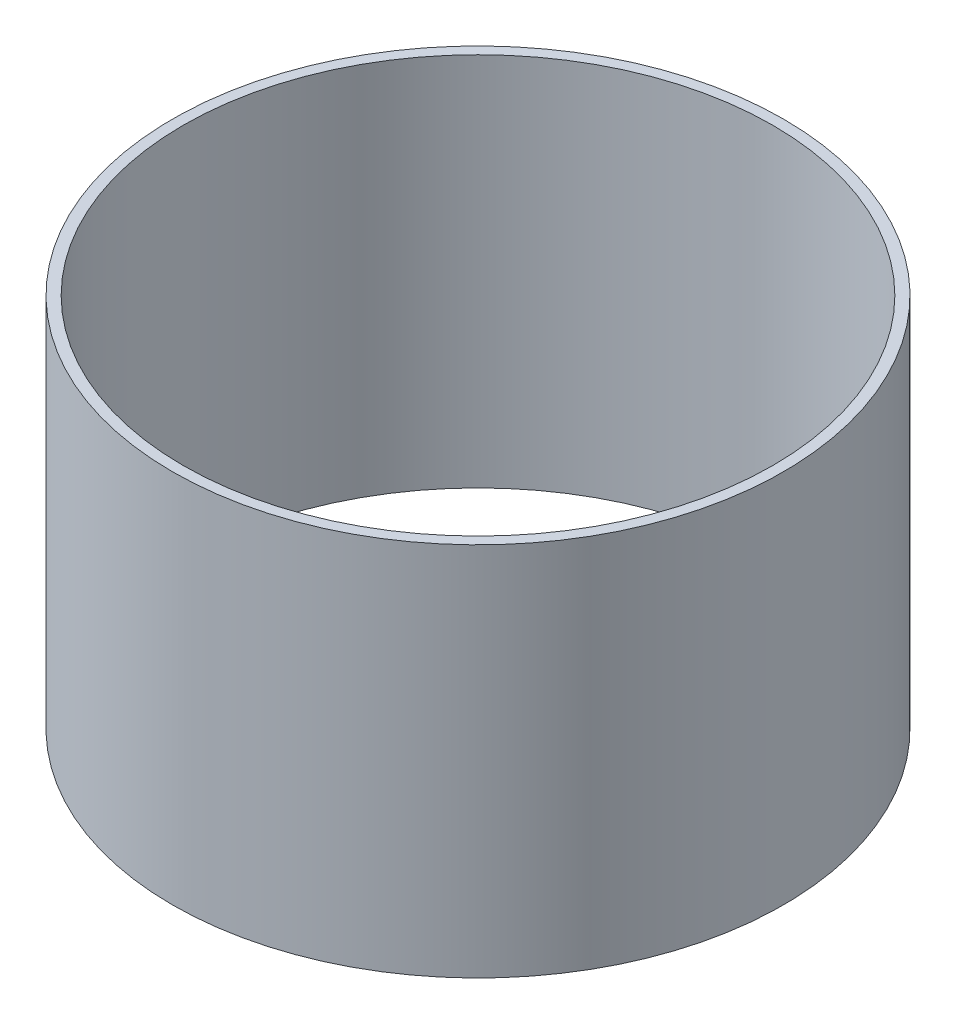
ISO-10303-21;
HEADER;
FILE_DESCRIPTION(('STEP AP214'),'2;1');
FILE_NAME('part.step','',(''),(''),'','','');
FILE_SCHEMA(('AUTOMOTIVE_DESIGN { 1 0 10303 214 1 1 1 1 }'));
ENDSEC;
DATA;
#1=APPLICATION_CONTEXT('core data for automotive mechanical design processes');
#2=APPLICATION_PROTOCOL_DEFINITION('international standard','automotive_design',2000,#1);
#3=PRODUCT_CONTEXT('',#1,'mechanical');
#4=PRODUCT('Part','Part','',(#3));
#5=PRODUCT_RELATED_PRODUCT_CATEGORY('part','',(#4));
#6=PRODUCT_DEFINITION_FORMATION('','',#4);
#7=PRODUCT_DEFINITION_CONTEXT('part definition',#1,'design');
#8=PRODUCT_DEFINITION('design','',#6,#7);
#9=PRODUCT_DEFINITION_SHAPE('','',#8);
#10=(LENGTH_UNIT() NAMED_UNIT(*) SI_UNIT(.MILLI.,.METRE.));
#11=(NAMED_UNIT(*) PLANE_ANGLE_UNIT() SI_UNIT($,.RADIAN.));
#12=(NAMED_UNIT(*) SI_UNIT($,.STERADIAN.) SOLID_ANGLE_UNIT());
#13=UNCERTAINTY_MEASURE_WITH_UNIT(LENGTH_MEASURE(1.E-05),#10,'distance_accuracy_value','');
#14=(GEOMETRIC_REPRESENTATION_CONTEXT(3) GLOBAL_UNCERTAINTY_ASSIGNED_CONTEXT((#13)) GLOBAL_UNIT_ASSIGNED_CONTEXT((#10,
#11,#12)) REPRESENTATION_CONTEXT('',''));
#15=CARTESIAN_POINT('',(0.,0.,0.));
#16=DIRECTION('',(0.,0.,1.));
#17=DIRECTION('',(1.,0.,0.));
#18=AXIS2_PLACEMENT_3D('',#15,#16,#17);
#19=CARTESIAN_POINT('',(0.,70.,0.));
#20=DIRECTION('',(0.,1.,0.));
#21=DIRECTION('',(0.,0.,1.));
#22=AXIS2_PLACEMENT_3D('',#19,#20,#21);
#23=PLANE('',#22);
#24=CARTESIAN_POINT('',(0.,70.,0.));
#25=DIRECTION('',(0.,1.,0.));
#26=DIRECTION('',(0.,0.,1.));
#27=AXIS2_PLACEMENT_3D('',#24,#25,#26);
#28=CIRCLE('',#27,57.);
#29=CARTESIAN_POINT('',(0.,70.,57.));
#30=VERTEX_POINT('',#29);
#31=EDGE_CURVE('E10',#30,#30,#28,.T.);
#32=ORIENTED_EDGE('',*,*,#31,.T.);
#33=EDGE_LOOP('',(#32));
#34=FACE_BOUND('',#33,.T.);
#35=CARTESIAN_POINT('',(0.,70.,0.));
#36=DIRECTION('',(0.,1.,0.));
#37=DIRECTION('',(0.,0.,1.));
#38=AXIS2_PLACEMENT_3D('',#35,#36,#37);
#39=CIRCLE('',#38,55.);
#40=CARTESIAN_POINT('',(0.,70.,55.));
#41=VERTEX_POINT('',#40);
#42=EDGE_CURVE('E42',#41,#41,#39,.T.);
#43=ORIENTED_EDGE('',*,*,#42,.F.);
#44=EDGE_LOOP('',(#43));
#45=FACE_BOUND('',#44,.T.);
#46=ADVANCED_FACE('F31',(#34,#45),#23,.T.);
#47=CARTESIAN_POINT('',(0.,0.,0.));
#48=DIRECTION('',(0.,1.,0.));
#49=DIRECTION('',(0.,0.,1.));
#50=AXIS2_PLACEMENT_3D('',#47,#48,#49);
#51=PLANE('',#50);
#52=CARTESIAN_POINT('',(0.,0.,0.));
#53=DIRECTION('',(0.,1.,0.));
#54=DIRECTION('',(0.,0.,1.));
#55=AXIS2_PLACEMENT_3D('',#52,#53,#54);
#56=CIRCLE('',#55,57.);
#57=CARTESIAN_POINT('',(0.,0.,57.));
#58=VERTEX_POINT('',#57);
#59=EDGE_CURVE('E35',#58,#58,#56,.T.);
#60=ORIENTED_EDGE('',*,*,#59,.F.);
#61=EDGE_LOOP('',(#60));
#62=FACE_BOUND('',#61,.T.);
#63=CARTESIAN_POINT('',(0.,0.,0.));
#64=DIRECTION('',(0.,1.,0.));
#65=DIRECTION('',(0.,0.,1.));
#66=AXIS2_PLACEMENT_3D('',#63,#64,#65);
#67=CIRCLE('',#66,55.);
#68=CARTESIAN_POINT('',(0.,0.,55.));
#69=VERTEX_POINT('',#68);
#70=EDGE_CURVE('E44',#69,#69,#67,.T.);
#71=ORIENTED_EDGE('',*,*,#70,.T.);
#72=EDGE_LOOP('',(#71));
#73=FACE_BOUND('',#72,.T.);
#74=ADVANCED_FACE('F54',(#62,#73),#51,.F.);
#75=CARTESIAN_POINT('',(0.,70.,0.));
#76=DIRECTION('',(0.,-1.,0.));
#77=DIRECTION('',(0.,0.,-1.));
#78=AXIS2_PLACEMENT_3D('',#75,#76,#77);
#79=CYLINDRICAL_SURFACE('',#78,57.);
#80=ORIENTED_EDGE('',*,*,#31,.F.);
#81=EDGE_LOOP('',(#80));
#82=FACE_BOUND('',#81,.T.);
#83=ORIENTED_EDGE('',*,*,#59,.T.);
#84=EDGE_LOOP('',(#83));
#85=FACE_BOUND('',#84,.T.);
#86=ADVANCED_FACE('F33',(#82,#85),#79,.T.);
#87=CARTESIAN_POINT('',(0.,70.,0.));
#88=DIRECTION('',(0.,-1.,0.));
#89=DIRECTION('',(0.,0.,-1.));
#90=AXIS2_PLACEMENT_3D('',#87,#88,#89);
#91=CYLINDRICAL_SURFACE('',#90,55.);
#92=ORIENTED_EDGE('',*,*,#42,.T.);
#93=EDGE_LOOP('',(#92));
#94=FACE_BOUND('',#93,.T.);
#95=ORIENTED_EDGE('',*,*,#70,.F.);
#96=EDGE_LOOP('',(#95));
#97=FACE_BOUND('',#96,.T.);
#98=ADVANCED_FACE('F50',(#94,#97),#91,.F.);
#99=CLOSED_SHELL('',(#46,#74,#86,#98));
#100=MANIFOLD_SOLID_BREP('B2',#99);
#101=ADVANCED_BREP_SHAPE_REPRESENTATION('',(#18,#100),#14);
#102=SHAPE_DEFINITION_REPRESENTATION(#9,#101);
ENDSEC;
END-ISO-10303-21;
